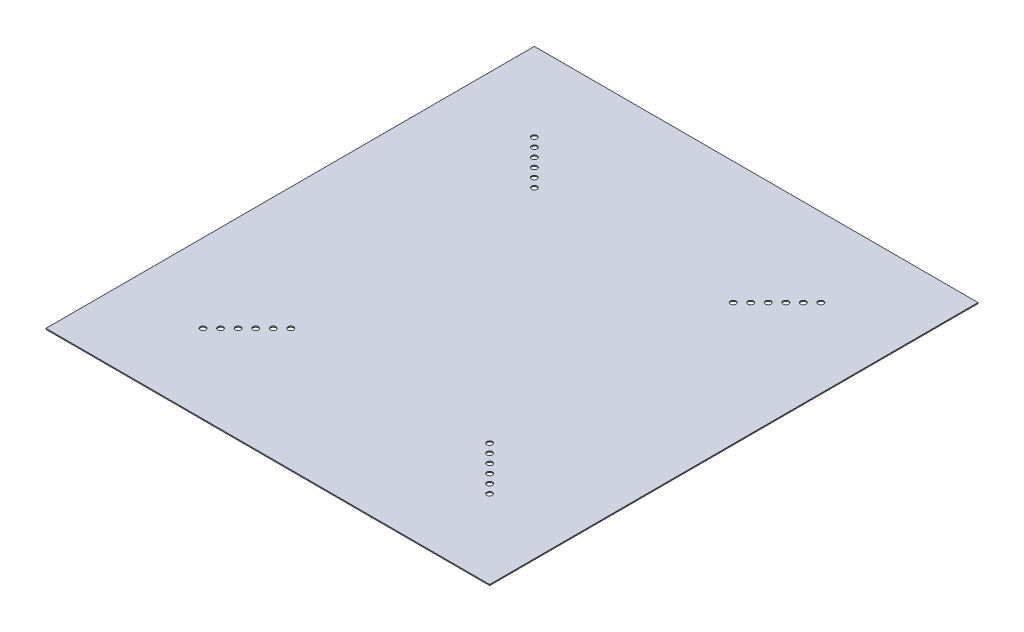
ISO-10303-21;
HEADER;
FILE_DESCRIPTION(('STEP AP214'),'2;1');
FILE_NAME('part.step','',(''),(''),'','','');
FILE_SCHEMA(('AUTOMOTIVE_DESIGN { 1 0 10303 214 1 1 1 1 }'));
ENDSEC;
DATA;
#1=APPLICATION_CONTEXT('core data for automotive mechanical design processes');
#2=APPLICATION_PROTOCOL_DEFINITION('international standard','automotive_design',2000,#1);
#3=PRODUCT_CONTEXT('',#1,'mechanical');
#4=PRODUCT('Part','Part','',(#3));
#5=PRODUCT_RELATED_PRODUCT_CATEGORY('part','',(#4));
#6=PRODUCT_DEFINITION_FORMATION('','',#4);
#7=PRODUCT_DEFINITION_CONTEXT('part definition',#1,'design');
#8=PRODUCT_DEFINITION('design','',#6,#7);
#9=PRODUCT_DEFINITION_SHAPE('','',#8);
#10=(LENGTH_UNIT() NAMED_UNIT(*) SI_UNIT(.MILLI.,.METRE.));
#11=(NAMED_UNIT(*) PLANE_ANGLE_UNIT() SI_UNIT($,.RADIAN.));
#12=(NAMED_UNIT(*) SI_UNIT($,.STERADIAN.) SOLID_ANGLE_UNIT());
#13=UNCERTAINTY_MEASURE_WITH_UNIT(LENGTH_MEASURE(1.E-05),#10,'distance_accuracy_value','');
#14=(GEOMETRIC_REPRESENTATION_CONTEXT(3) GLOBAL_UNCERTAINTY_ASSIGNED_CONTEXT((#13)) GLOBAL_UNIT_ASSIGNED_CONTEXT((#10,
#11,#12)) REPRESENTATION_CONTEXT('',''));
#15=CARTESIAN_POINT('',(0.,0.,0.));
#16=DIRECTION('',(0.,0.,1.));
#17=DIRECTION('',(1.,0.,0.));
#18=AXIS2_PLACEMENT_3D('',#15,#16,#17);
#19=CARTESIAN_POINT('',(0.,0.79375,0.));
#20=DIRECTION('',(0.,-1.,0.));
#21=DIRECTION('',(0.,0.,-1.));
#22=AXIS2_PLACEMENT_3D('',#19,#20,#21);
#23=PLANE('',#22);
#24=CARTESIAN_POINT('',(101.375082938258,0.793750000000001,119.392074349267));
#25=DIRECTION('',(0.,1.,0.));
#26=DIRECTION('',(0.,0.,1.));
#27=AXIS2_PLACEMENT_3D('',#24,#25,#26);
#28=CIRCLE('',#27,2.24999999999999);
#29=CARTESIAN_POINT('',(101.375082938258,0.793750000000001,121.642074349267));
#30=VERTEX_POINT('',#29);
#31=EDGE_CURVE('E235',#30,#30,#28,.T.);
#32=ORIENTED_EDGE('',*,*,#31,.F.);
#33=EDGE_LOOP('',(#32));
#34=FACE_BOUND('',#33,.T.);
#35=CARTESIAN_POINT('',(115.517218561989,0.793750000000001,-133.534209972998));
#36=DIRECTION('',(0.,1.,0.));
#37=DIRECTION('',(0.,0.,1.));
#38=AXIS2_PLACEMENT_3D('',#35,#36,#37);
#39=CIRCLE('',#38,2.24999999999999);
#40=CARTESIAN_POINT('',(115.517218561989,0.793750000000001,-131.284209972998));
#41=VERTEX_POINT('',#40);
#42=EDGE_CURVE('E50',#41,#41,#39,.T.);
#43=ORIENTED_EDGE('',*,*,#42,.F.);
#44=EDGE_LOOP('',(#43));
#45=FACE_BOUND('',#44,.T.);
#46=CARTESIAN_POINT('',(108.446150750124,0.793750000000001,-126.463142161133));
#47=DIRECTION('',(0.,1.,0.));
#48=DIRECTION('',(0.,0.,1.));
#49=AXIS2_PLACEMENT_3D('',#46,#47,#48);
#50=CIRCLE('',#49,2.24999999999999);
#51=CARTESIAN_POINT('',(108.446150750124,0.793750000000001,-124.213142161133));
#52=VERTEX_POINT('',#51);
#53=EDGE_CURVE('E291',#52,#52,#50,.T.);
#54=ORIENTED_EDGE('',*,*,#53,.F.);
#55=EDGE_LOOP('',(#54));
#56=FACE_BOUND('',#55,.T.);
#57=CARTESIAN_POINT('',(101.375082938258,0.793750000000001,-119.392074349267));
#58=DIRECTION('',(0.,1.,0.));
#59=DIRECTION('',(0.,0.,1.));
#60=AXIS2_PLACEMENT_3D('',#57,#58,#59);
#61=CIRCLE('',#60,2.24999999999999);
#62=CARTESIAN_POINT('',(101.375082938258,0.793750000000001,-117.142074349267));
#63=VERTEX_POINT('',#62);
#64=EDGE_CURVE('E283',#63,#63,#61,.T.);
#65=ORIENTED_EDGE('',*,*,#64,.F.);
#66=EDGE_LOOP('',(#65));
#67=FACE_BOUND('',#66,.T.);
#68=CARTESIAN_POINT('',(94.3040151263927,0.793750000000001,-112.321006537402));
#69=DIRECTION('',(0.,1.,0.));
#70=DIRECTION('',(0.,0.,1.));
#71=AXIS2_PLACEMENT_3D('',#68,#69,#70);
#72=CIRCLE('',#71,2.24999999999999);
#73=CARTESIAN_POINT('',(94.3040151263927,0.793750000000001,-110.071006537402));
#74=VERTEX_POINT('',#73);
#75=EDGE_CURVE('E275',#74,#74,#72,.T.);
#76=ORIENTED_EDGE('',*,*,#75,.F.);
#77=EDGE_LOOP('',(#76));
#78=FACE_BOUND('',#77,.T.);
#79=CARTESIAN_POINT('',(87.2329473145272,0.793750000000001,-105.249938725536));
#80=DIRECTION('',(0.,1.,0.));
#81=DIRECTION('',(0.,0.,1.));
#82=AXIS2_PLACEMENT_3D('',#79,#80,#81);
#83=CIRCLE('',#82,2.24999999999999);
#84=CARTESIAN_POINT('',(87.2329473145272,0.793750000000001,-102.999938725536));
#85=VERTEX_POINT('',#84);
#86=EDGE_CURVE('E267',#85,#85,#83,.T.);
#87=ORIENTED_EDGE('',*,*,#86,.F.);
#88=EDGE_LOOP('',(#87));
#89=FACE_BOUND('',#88,.T.);
#90=CARTESIAN_POINT('',(80.1618795026618,0.793750000000001,-98.1788709136707));
#91=DIRECTION('',(0.,1.,0.));
#92=DIRECTION('',(0.,0.,1.));
#93=AXIS2_PLACEMENT_3D('',#90,#91,#92);
#94=CIRCLE('',#93,2.24999999999999);
#95=CARTESIAN_POINT('',(80.1618795026618,0.793750000000001,-95.9288709136707));
#96=VERTEX_POINT('',#95);
#97=EDGE_CURVE('E259',#96,#96,#94,.T.);
#98=ORIENTED_EDGE('',*,*,#97,.F.);
#99=EDGE_LOOP('',(#98));
#100=FACE_BOUND('',#99,.T.);
#101=CARTESIAN_POINT('',(115.517218561989,0.793750000000001,133.534209972998));
#102=DIRECTION('',(0.,1.,0.));
#103=DIRECTION('',(0.,0.,1.));
#104=AXIS2_PLACEMENT_3D('',#101,#102,#103);
#105=CIRCLE('',#104,2.24999999999999);
#106=CARTESIAN_POINT('',(115.517218561989,0.793750000000001,135.784209972998));
#107=VERTEX_POINT('',#106);
#108=EDGE_CURVE('E251',#107,#107,#105,.T.);
#109=ORIENTED_EDGE('',*,*,#108,.F.);
#110=EDGE_LOOP('',(#109));
#111=FACE_BOUND('',#110,.T.);
#112=CARTESIAN_POINT('',(108.446150750124,0.793750000000001,126.463142161133));
#113=DIRECTION('',(0.,1.,0.));
#114=DIRECTION('',(0.,0.,1.));
#115=AXIS2_PLACEMENT_3D('',#112,#113,#114);
#116=CIRCLE('',#115,2.24999999999999);
#117=CARTESIAN_POINT('',(108.446150750124,0.793750000000001,128.713142161133));
#118=VERTEX_POINT('',#117);
#119=EDGE_CURVE('E243',#118,#118,#116,.T.);
#120=ORIENTED_EDGE('',*,*,#119,.F.);
#121=EDGE_LOOP('',(#120));
#122=FACE_BOUND('',#121,.T.);
#123=CARTESIAN_POINT('',(94.3040151263927,0.793750000000001,112.321006537402));
#124=DIRECTION('',(0.,1.,0.));
#125=DIRECTION('',(0.,0.,1.));
#126=AXIS2_PLACEMENT_3D('',#123,#124,#125);
#127=CIRCLE('',#126,2.24999999999999);
#128=CARTESIAN_POINT('',(94.3040151263927,0.793750000000001,114.571006537402));
#129=VERTEX_POINT('',#128);
#130=EDGE_CURVE('E227',#129,#129,#127,.T.);
#131=ORIENTED_EDGE('',*,*,#130,.F.);
#132=EDGE_LOOP('',(#131));
#133=FACE_BOUND('',#132,.T.);
#134=CARTESIAN_POINT('',(87.2329473145272,0.793750000000001,105.249938725536));
#135=DIRECTION('',(0.,1.,0.));
#136=DIRECTION('',(0.,0.,1.));
#137=AXIS2_PLACEMENT_3D('',#134,#135,#136);
#138=CIRCLE('',#137,2.24999999999999);
#139=CARTESIAN_POINT('',(87.2329473145272,0.793750000000001,107.499938725536));
#140=VERTEX_POINT('',#139);
#141=EDGE_CURVE('E219',#140,#140,#138,.T.);
#142=ORIENTED_EDGE('',*,*,#141,.F.);
#143=EDGE_LOOP('',(#142));
#144=FACE_BOUND('',#143,.T.);
#145=CARTESIAN_POINT('',(80.1618795026618,0.793750000000001,98.1788709136707));
#146=DIRECTION('',(0.,1.,0.));
#147=DIRECTION('',(0.,0.,1.));
#148=AXIS2_PLACEMENT_3D('',#145,#146,#147);
#149=CIRCLE('',#148,2.24999999999999);
#150=CARTESIAN_POINT('',(80.1618795026618,0.793750000000001,100.428870913671));
#151=VERTEX_POINT('',#150);
#152=EDGE_CURVE('E211',#151,#151,#149,.T.);
#153=ORIENTED_EDGE('',*,*,#152,.F.);
#154=EDGE_LOOP('',(#153));
#155=FACE_BOUND('',#154,.T.);
#156=CARTESIAN_POINT('',(-115.517218561989,0.793750000000001,133.534209972998));
#157=DIRECTION('',(0.,1.,0.));
#158=DIRECTION('',(0.,0.,1.));
#159=AXIS2_PLACEMENT_3D('',#156,#157,#158);
#160=CIRCLE('',#159,2.24999999999999);
#161=CARTESIAN_POINT('',(-115.517218561989,0.793750000000001,135.784209972998));
#162=VERTEX_POINT('',#161);
#163=EDGE_CURVE('E203',#162,#162,#160,.T.);
#164=ORIENTED_EDGE('',*,*,#163,.F.);
#165=EDGE_LOOP('',(#164));
#166=FACE_BOUND('',#165,.T.);
#167=CARTESIAN_POINT('',(-108.446150750124,0.793750000000001,126.463142161133));
#168=DIRECTION('',(0.,1.,0.));
#169=DIRECTION('',(0.,0.,1.));
#170=AXIS2_PLACEMENT_3D('',#167,#168,#169);
#171=CIRCLE('',#170,2.24999999999999);
#172=CARTESIAN_POINT('',(-108.446150750124,0.793750000000001,128.713142161133));
#173=VERTEX_POINT('',#172);
#174=EDGE_CURVE('E195',#173,#173,#171,.T.);
#175=ORIENTED_EDGE('',*,*,#174,.F.);
#176=EDGE_LOOP('',(#175));
#177=FACE_BOUND('',#176,.T.);
#178=CARTESIAN_POINT('',(-101.375082938258,0.793750000000001,119.392074349267));
#179=DIRECTION('',(0.,1.,0.));
#180=DIRECTION('',(0.,0.,1.));
#181=AXIS2_PLACEMENT_3D('',#178,#179,#180);
#182=CIRCLE('',#181,2.24999999999999);
#183=CARTESIAN_POINT('',(-101.375082938258,0.793750000000001,121.642074349267));
#184=VERTEX_POINT('',#183);
#185=EDGE_CURVE('E187',#184,#184,#182,.T.);
#186=ORIENTED_EDGE('',*,*,#185,.F.);
#187=EDGE_LOOP('',(#186));
#188=FACE_BOUND('',#187,.T.);
#189=CARTESIAN_POINT('',(-94.3040151263927,0.793750000000001,112.321006537402));
#190=DIRECTION('',(0.,1.,0.));
#191=DIRECTION('',(0.,0.,1.));
#192=AXIS2_PLACEMENT_3D('',#189,#190,#191);
#193=CIRCLE('',#192,2.24999999999999);
#194=CARTESIAN_POINT('',(-94.3040151263927,0.793750000000001,114.571006537402));
#195=VERTEX_POINT('',#194);
#196=EDGE_CURVE('E179',#195,#195,#193,.T.);
#197=ORIENTED_EDGE('',*,*,#196,.F.);
#198=EDGE_LOOP('',(#197));
#199=FACE_BOUND('',#198,.T.);
#200=CARTESIAN_POINT('',(-87.2329473145272,0.793750000000001,105.249938725536));
#201=DIRECTION('',(0.,1.,0.));
#202=DIRECTION('',(0.,0.,1.));
#203=AXIS2_PLACEMENT_3D('',#200,#201,#202);
#204=CIRCLE('',#203,2.24999999999999);
#205=CARTESIAN_POINT('',(-87.2329473145272,0.793750000000001,107.499938725536));
#206=VERTEX_POINT('',#205);
#207=EDGE_CURVE('E171',#206,#206,#204,.T.);
#208=ORIENTED_EDGE('',*,*,#207,.F.);
#209=EDGE_LOOP('',(#208));
#210=FACE_BOUND('',#209,.T.);
#211=CARTESIAN_POINT('',(-80.1618795026618,0.793750000000001,98.1788709136707));
#212=DIRECTION('',(0.,1.,0.));
#213=DIRECTION('',(0.,0.,1.));
#214=AXIS2_PLACEMENT_3D('',#211,#212,#213);
#215=CIRCLE('',#214,2.24999999999999);
#216=CARTESIAN_POINT('',(-80.1618795026618,0.793750000000001,100.428870913671));
#217=VERTEX_POINT('',#216);
#218=EDGE_CURVE('E163',#217,#217,#215,.T.);
#219=ORIENTED_EDGE('',*,*,#218,.F.);
#220=EDGE_LOOP('',(#219));
#221=FACE_BOUND('',#220,.T.);
#222=CARTESIAN_POINT('',(-115.517218561989,0.793750000000001,-133.534209972998));
#223=DIRECTION('',(0.,1.,0.));
#224=DIRECTION('',(0.,0.,1.));
#225=AXIS2_PLACEMENT_3D('',#222,#223,#224);
#226=CIRCLE('',#225,2.24999999999999);
#227=CARTESIAN_POINT('',(-115.517218561989,0.793750000000001,-131.284209972998));
#228=VERTEX_POINT('',#227);
#229=EDGE_CURVE('E155',#228,#228,#226,.T.);
#230=ORIENTED_EDGE('',*,*,#229,.F.);
#231=EDGE_LOOP('',(#230));
#232=FACE_BOUND('',#231,.T.);
#233=CARTESIAN_POINT('',(-108.446150750124,0.793750000000001,-126.463142161133));
#234=DIRECTION('',(0.,1.,0.));
#235=DIRECTION('',(0.,0.,1.));
#236=AXIS2_PLACEMENT_3D('',#233,#234,#235);
#237=CIRCLE('',#236,2.24999999999999);
#238=CARTESIAN_POINT('',(-108.446150750124,0.793750000000001,-124.213142161133));
#239=VERTEX_POINT('',#238);
#240=EDGE_CURVE('E147',#239,#239,#237,.T.);
#241=ORIENTED_EDGE('',*,*,#240,.F.);
#242=EDGE_LOOP('',(#241));
#243=FACE_BOUND('',#242,.T.);
#244=CARTESIAN_POINT('',(-101.375082938258,0.793750000000001,-119.392074349267));
#245=DIRECTION('',(0.,1.,0.));
#246=DIRECTION('',(0.,0.,1.));
#247=AXIS2_PLACEMENT_3D('',#244,#245,#246);
#248=CIRCLE('',#247,2.24999999999999);
#249=CARTESIAN_POINT('',(-101.375082938258,0.793750000000001,-117.142074349267));
#250=VERTEX_POINT('',#249);
#251=EDGE_CURVE('E139',#250,#250,#248,.T.);
#252=ORIENTED_EDGE('',*,*,#251,.F.);
#253=EDGE_LOOP('',(#252));
#254=FACE_BOUND('',#253,.T.);
#255=CARTESIAN_POINT('',(-94.3040151263927,0.793750000000001,-112.321006537402));
#256=DIRECTION('',(0.,1.,0.));
#257=DIRECTION('',(0.,0.,1.));
#258=AXIS2_PLACEMENT_3D('',#255,#256,#257);
#259=CIRCLE('',#258,2.24999999999999);
#260=CARTESIAN_POINT('',(-94.3040151263927,0.793750000000001,-110.071006537402));
#261=VERTEX_POINT('',#260);
#262=EDGE_CURVE('E131',#261,#261,#259,.T.);
#263=ORIENTED_EDGE('',*,*,#262,.F.);
#264=EDGE_LOOP('',(#263));
#265=FACE_BOUND('',#264,.T.);
#266=CARTESIAN_POINT('',(-87.2329473145272,0.793750000000001,-105.249938725536));
#267=DIRECTION('',(0.,1.,0.));
#268=DIRECTION('',(0.,0.,1.));
#269=AXIS2_PLACEMENT_3D('',#266,#267,#268);
#270=CIRCLE('',#269,2.24999999999999);
#271=CARTESIAN_POINT('',(-87.2329473145272,0.793750000000001,-102.999938725536));
#272=VERTEX_POINT('',#271);
#273=EDGE_CURVE('E123',#272,#272,#270,.T.);
#274=ORIENTED_EDGE('',*,*,#273,.F.);
#275=EDGE_LOOP('',(#274));
#276=FACE_BOUND('',#275,.T.);
#277=CARTESIAN_POINT('',(-80.1618795026618,0.793750000000001,-98.1788709136707));
#278=DIRECTION('',(0.,1.,0.));
#279=DIRECTION('',(0.,0.,1.));
#280=AXIS2_PLACEMENT_3D('',#277,#278,#279);
#281=CIRCLE('',#280,2.24999999999999);
#282=CARTESIAN_POINT('',(-80.1618795026618,0.793750000000001,-95.9288709136707));
#283=VERTEX_POINT('',#282);
#284=EDGE_CURVE('E114',#283,#283,#281,.T.);
#285=ORIENTED_EDGE('',*,*,#284,.F.);
#286=EDGE_LOOP('',(#285));
#287=FACE_BOUND('',#286,.T.);
#288=DIRECTION('',(0.,0.,-1.));
#289=VECTOR('',#288,1.);
#290=CARTESIAN_POINT('',(178.833008588991,0.79375,196.85));
#291=LINE('',#290,#289);
#292=CARTESIAN_POINT('',(178.833008588991,0.79375,196.85));
#293=VERTEX_POINT('',#292);
#294=CARTESIAN_POINT('',(178.833008588991,0.79375,-196.85));
#295=VERTEX_POINT('',#294);
#296=EDGE_CURVE('E93',#293,#295,#291,.T.);
#297=ORIENTED_EDGE('',*,*,#296,.T.);
#298=DIRECTION('',(-1.,0.,0.));
#299=VECTOR('',#298,1.);
#300=CARTESIAN_POINT('',(-178.833008588991,0.79375,-196.85));
#301=LINE('',#300,#299);
#302=CARTESIAN_POINT('',(-178.833008588991,0.79375,-196.85));
#303=VERTEX_POINT('',#302);
#304=EDGE_CURVE('E354',#295,#303,#301,.T.);
#305=ORIENTED_EDGE('',*,*,#304,.T.);
#306=DIRECTION('',(0.,0.,1.));
#307=VECTOR('',#306,1.);
#308=CARTESIAN_POINT('',(-178.833008588991,0.79375,196.85));
#309=LINE('',#308,#307);
#310=CARTESIAN_POINT('',(-178.833008588991,0.79375,196.85));
#311=VERTEX_POINT('',#310);
#312=EDGE_CURVE('E358',#303,#311,#309,.T.);
#313=ORIENTED_EDGE('',*,*,#312,.T.);
#314=DIRECTION('',(1.,0.,0.));
#315=VECTOR('',#314,1.);
#316=CARTESIAN_POINT('',(-178.833008588991,0.79375,196.85));
#317=LINE('',#316,#315);
#318=EDGE_CURVE('E119',#311,#293,#317,.T.);
#319=ORIENTED_EDGE('',*,*,#318,.T.);
#320=EDGE_LOOP('',(#297,#305,#313,#319));
#321=FACE_BOUND('',#320,.T.);
#322=ADVANCED_FACE('F41',(#34,#45,#56,#67,#78,#89,#100,#111,#122,#133,#144,#155,#166,#177,#188,
#199,#210,#221,#232,#243,#254,#265,#276,#287,#321),#23,.F.);
#323=CARTESIAN_POINT('',(0.,0.,0.));
#324=DIRECTION('',(0.,-1.,0.));
#325=DIRECTION('',(0.,0.,-1.));
#326=AXIS2_PLACEMENT_3D('',#323,#324,#325);
#327=PLANE('',#326);
#328=CARTESIAN_POINT('',(-87.2329473145272,0.,-105.249938725536));
#329=DIRECTION('',(0.,1.,0.));
#330=DIRECTION('',(0.,0.,1.));
#331=AXIS2_PLACEMENT_3D('',#328,#329,#330);
#332=CIRCLE('',#331,2.25);
#333=CARTESIAN_POINT('',(-87.2329473145272,0.,-102.999938725536));
#334=VERTEX_POINT('',#333);
#335=EDGE_CURVE('E127',#334,#334,#332,.T.);
#336=ORIENTED_EDGE('',*,*,#335,.T.);
#337=EDGE_LOOP('',(#336));
#338=FACE_BOUND('',#337,.T.);
#339=CARTESIAN_POINT('',(-101.375082938258,0.,-119.392074349267));
#340=DIRECTION('',(0.,1.,0.));
#341=DIRECTION('',(0.,0.,1.));
#342=AXIS2_PLACEMENT_3D('',#339,#340,#341);
#343=CIRCLE('',#342,2.25);
#344=CARTESIAN_POINT('',(-101.375082938258,0.,-117.142074349267));
#345=VERTEX_POINT('',#344);
#346=EDGE_CURVE('E143',#345,#345,#343,.T.);
#347=ORIENTED_EDGE('',*,*,#346,.T.);
#348=EDGE_LOOP('',(#347));
#349=FACE_BOUND('',#348,.T.);
#350=CARTESIAN_POINT('',(-115.517218561989,0.,-133.534209972998));
#351=DIRECTION('',(0.,1.,0.));
#352=DIRECTION('',(0.,0.,1.));
#353=AXIS2_PLACEMENT_3D('',#350,#351,#352);
#354=CIRCLE('',#353,2.25);
#355=CARTESIAN_POINT('',(-115.517218561989,0.,-131.284209972998));
#356=VERTEX_POINT('',#355);
#357=EDGE_CURVE('E159',#356,#356,#354,.T.);
#358=ORIENTED_EDGE('',*,*,#357,.T.);
#359=EDGE_LOOP('',(#358));
#360=FACE_BOUND('',#359,.T.);
#361=CARTESIAN_POINT('',(-87.2329473145272,0.,105.249938725536));
#362=DIRECTION('',(0.,1.,0.));
#363=DIRECTION('',(0.,0.,1.));
#364=AXIS2_PLACEMENT_3D('',#361,#362,#363);
#365=CIRCLE('',#364,2.25);
#366=CARTESIAN_POINT('',(-87.2329473145272,0.,107.499938725536));
#367=VERTEX_POINT('',#366);
#368=EDGE_CURVE('E175',#367,#367,#365,.T.);
#369=ORIENTED_EDGE('',*,*,#368,.T.);
#370=EDGE_LOOP('',(#369));
#371=FACE_BOUND('',#370,.T.);
#372=CARTESIAN_POINT('',(-101.375082938258,0.,119.392074349267));
#373=DIRECTION('',(0.,1.,0.));
#374=DIRECTION('',(0.,0.,1.));
#375=AXIS2_PLACEMENT_3D('',#372,#373,#374);
#376=CIRCLE('',#375,2.25);
#377=CARTESIAN_POINT('',(-101.375082938258,0.,121.642074349267));
#378=VERTEX_POINT('',#377);
#379=EDGE_CURVE('E191',#378,#378,#376,.T.);
#380=ORIENTED_EDGE('',*,*,#379,.T.);
#381=EDGE_LOOP('',(#380));
#382=FACE_BOUND('',#381,.T.);
#383=CARTESIAN_POINT('',(-115.517218561989,0.,133.534209972998));
#384=DIRECTION('',(0.,1.,0.));
#385=DIRECTION('',(0.,0.,1.));
#386=AXIS2_PLACEMENT_3D('',#383,#384,#385);
#387=CIRCLE('',#386,2.25);
#388=CARTESIAN_POINT('',(-115.517218561989,0.,135.784209972998));
#389=VERTEX_POINT('',#388);
#390=EDGE_CURVE('E207',#389,#389,#387,.T.);
#391=ORIENTED_EDGE('',*,*,#390,.T.);
#392=EDGE_LOOP('',(#391));
#393=FACE_BOUND('',#392,.T.);
#394=CARTESIAN_POINT('',(80.1618795026618,0.,98.1788709136707));
#395=DIRECTION('',(0.,1.,0.));
#396=DIRECTION('',(0.,0.,1.));
#397=AXIS2_PLACEMENT_3D('',#394,#395,#396);
#398=CIRCLE('',#397,2.25);
#399=CARTESIAN_POINT('',(80.1618795026618,0.,100.428870913671));
#400=VERTEX_POINT('',#399);
#401=EDGE_CURVE('E215',#400,#400,#398,.T.);
#402=ORIENTED_EDGE('',*,*,#401,.T.);
#403=EDGE_LOOP('',(#402));
#404=FACE_BOUND('',#403,.T.);
#405=CARTESIAN_POINT('',(94.3040151263927,0.,112.321006537402));
#406=DIRECTION('',(0.,1.,0.));
#407=DIRECTION('',(0.,0.,1.));
#408=AXIS2_PLACEMENT_3D('',#405,#406,#407);
#409=CIRCLE('',#408,2.25);
#410=CARTESIAN_POINT('',(94.3040151263927,0.,114.571006537402));
#411=VERTEX_POINT('',#410);
#412=EDGE_CURVE('E231',#411,#411,#409,.T.);
#413=ORIENTED_EDGE('',*,*,#412,.T.);
#414=EDGE_LOOP('',(#413));
#415=FACE_BOUND('',#414,.T.);
#416=CARTESIAN_POINT('',(108.446150750124,0.,126.463142161133));
#417=DIRECTION('',(0.,1.,0.));
#418=DIRECTION('',(0.,0.,1.));
#419=AXIS2_PLACEMENT_3D('',#416,#417,#418);
#420=CIRCLE('',#419,2.25);
#421=CARTESIAN_POINT('',(108.446150750124,0.,128.713142161133));
#422=VERTEX_POINT('',#421);
#423=EDGE_CURVE('E247',#422,#422,#420,.T.);
#424=ORIENTED_EDGE('',*,*,#423,.T.);
#425=EDGE_LOOP('',(#424));
#426=FACE_BOUND('',#425,.T.);
#427=CARTESIAN_POINT('',(80.1618795026618,0.,-98.1788709136707));
#428=DIRECTION('',(0.,1.,0.));
#429=DIRECTION('',(0.,0.,1.));
#430=AXIS2_PLACEMENT_3D('',#427,#428,#429);
#431=CIRCLE('',#430,2.25);
#432=CARTESIAN_POINT('',(80.1618795026618,0.,-95.9288709136707));
#433=VERTEX_POINT('',#432);
#434=EDGE_CURVE('E263',#433,#433,#431,.T.);
#435=ORIENTED_EDGE('',*,*,#434,.T.);
#436=EDGE_LOOP('',(#435));
#437=FACE_BOUND('',#436,.T.);
#438=CARTESIAN_POINT('',(94.3040151263927,0.,-112.321006537402));
#439=DIRECTION('',(0.,1.,0.));
#440=DIRECTION('',(0.,0.,1.));
#441=AXIS2_PLACEMENT_3D('',#438,#439,#440);
#442=CIRCLE('',#441,2.25);
#443=CARTESIAN_POINT('',(94.3040151263927,0.,-110.071006537402));
#444=VERTEX_POINT('',#443);
#445=EDGE_CURVE('E279',#444,#444,#442,.T.);
#446=ORIENTED_EDGE('',*,*,#445,.T.);
#447=EDGE_LOOP('',(#446));
#448=FACE_BOUND('',#447,.T.);
#449=CARTESIAN_POINT('',(108.446150750124,0.,-126.463142161133));
#450=DIRECTION('',(0.,1.,0.));
#451=DIRECTION('',(0.,0.,1.));
#452=AXIS2_PLACEMENT_3D('',#449,#450,#451);
#453=CIRCLE('',#452,2.25);
#454=CARTESIAN_POINT('',(108.446150750124,0.,-124.213142161133));
#455=VERTEX_POINT('',#454);
#456=EDGE_CURVE('E295',#455,#455,#453,.T.);
#457=ORIENTED_EDGE('',*,*,#456,.T.);
#458=EDGE_LOOP('',(#457));
#459=FACE_BOUND('',#458,.T.);
#460=CARTESIAN_POINT('',(115.517218561989,0.,-133.534209972998));
#461=DIRECTION('',(0.,1.,0.));
#462=DIRECTION('',(0.,0.,1.));
#463=AXIS2_PLACEMENT_3D('',#460,#461,#462);
#464=CIRCLE('',#463,2.25);
#465=CARTESIAN_POINT('',(115.517218561989,0.,-131.284209972998));
#466=VERTEX_POINT('',#465);
#467=EDGE_CURVE('E11',#466,#466,#464,.T.);
#468=ORIENTED_EDGE('',*,*,#467,.T.);
#469=EDGE_LOOP('',(#468));
#470=FACE_BOUND('',#469,.T.);
#471=CARTESIAN_POINT('',(101.375082938258,0.,-119.392074349267));
#472=DIRECTION('',(0.,1.,0.));
#473=DIRECTION('',(0.,0.,1.));
#474=AXIS2_PLACEMENT_3D('',#471,#472,#473);
#475=CIRCLE('',#474,2.25);
#476=CARTESIAN_POINT('',(101.375082938258,0.,-117.142074349267));
#477=VERTEX_POINT('',#476);
#478=EDGE_CURVE('E287',#477,#477,#475,.T.);
#479=ORIENTED_EDGE('',*,*,#478,.T.);
#480=EDGE_LOOP('',(#479));
#481=FACE_BOUND('',#480,.T.);
#482=CARTESIAN_POINT('',(87.2329473145272,0.,-105.249938725536));
#483=DIRECTION('',(0.,1.,0.));
#484=DIRECTION('',(0.,0.,1.));
#485=AXIS2_PLACEMENT_3D('',#482,#483,#484);
#486=CIRCLE('',#485,2.25);
#487=CARTESIAN_POINT('',(87.2329473145272,0.,-102.999938725536));
#488=VERTEX_POINT('',#487);
#489=EDGE_CURVE('E271',#488,#488,#486,.T.);
#490=ORIENTED_EDGE('',*,*,#489,.T.);
#491=EDGE_LOOP('',(#490));
#492=FACE_BOUND('',#491,.T.);
#493=CARTESIAN_POINT('',(115.517218561989,0.,133.534209972998));
#494=DIRECTION('',(0.,1.,0.));
#495=DIRECTION('',(0.,0.,1.));
#496=AXIS2_PLACEMENT_3D('',#493,#494,#495);
#497=CIRCLE('',#496,2.25);
#498=CARTESIAN_POINT('',(115.517218561989,0.,135.784209972998));
#499=VERTEX_POINT('',#498);
#500=EDGE_CURVE('E255',#499,#499,#497,.T.);
#501=ORIENTED_EDGE('',*,*,#500,.T.);
#502=EDGE_LOOP('',(#501));
#503=FACE_BOUND('',#502,.T.);
#504=CARTESIAN_POINT('',(101.375082938258,0.,119.392074349267));
#505=DIRECTION('',(0.,1.,0.));
#506=DIRECTION('',(0.,0.,1.));
#507=AXIS2_PLACEMENT_3D('',#504,#505,#506);
#508=CIRCLE('',#507,2.25);
#509=CARTESIAN_POINT('',(101.375082938258,0.,121.642074349267));
#510=VERTEX_POINT('',#509);
#511=EDGE_CURVE('E239',#510,#510,#508,.T.);
#512=ORIENTED_EDGE('',*,*,#511,.T.);
#513=EDGE_LOOP('',(#512));
#514=FACE_BOUND('',#513,.T.);
#515=CARTESIAN_POINT('',(87.2329473145272,0.,105.249938725536));
#516=DIRECTION('',(0.,1.,0.));
#517=DIRECTION('',(0.,0.,1.));
#518=AXIS2_PLACEMENT_3D('',#515,#516,#517);
#519=CIRCLE('',#518,2.25);
#520=CARTESIAN_POINT('',(87.2329473145272,0.,107.499938725536));
#521=VERTEX_POINT('',#520);
#522=EDGE_CURVE('E223',#521,#521,#519,.T.);
#523=ORIENTED_EDGE('',*,*,#522,.T.);
#524=EDGE_LOOP('',(#523));
#525=FACE_BOUND('',#524,.T.);
#526=CARTESIAN_POINT('',(-108.446150750124,0.,126.463142161133));
#527=DIRECTION('',(0.,1.,0.));
#528=DIRECTION('',(0.,0.,1.));
#529=AXIS2_PLACEMENT_3D('',#526,#527,#528);
#530=CIRCLE('',#529,2.25);
#531=CARTESIAN_POINT('',(-108.446150750124,0.,128.713142161133));
#532=VERTEX_POINT('',#531);
#533=EDGE_CURVE('E199',#532,#532,#530,.T.);
#534=ORIENTED_EDGE('',*,*,#533,.T.);
#535=EDGE_LOOP('',(#534));
#536=FACE_BOUND('',#535,.T.);
#537=CARTESIAN_POINT('',(-94.3040151263927,0.,112.321006537402));
#538=DIRECTION('',(0.,1.,0.));
#539=DIRECTION('',(0.,0.,1.));
#540=AXIS2_PLACEMENT_3D('',#537,#538,#539);
#541=CIRCLE('',#540,2.25);
#542=CARTESIAN_POINT('',(-94.3040151263927,0.,114.571006537402));
#543=VERTEX_POINT('',#542);
#544=EDGE_CURVE('E183',#543,#543,#541,.T.);
#545=ORIENTED_EDGE('',*,*,#544,.T.);
#546=EDGE_LOOP('',(#545));
#547=FACE_BOUND('',#546,.T.);
#548=CARTESIAN_POINT('',(-80.1618795026618,0.,98.1788709136707));
#549=DIRECTION('',(0.,1.,0.));
#550=DIRECTION('',(0.,0.,1.));
#551=AXIS2_PLACEMENT_3D('',#548,#549,#550);
#552=CIRCLE('',#551,2.25);
#553=CARTESIAN_POINT('',(-80.1618795026618,0.,100.428870913671));
#554=VERTEX_POINT('',#553);
#555=EDGE_CURVE('E167',#554,#554,#552,.T.);
#556=ORIENTED_EDGE('',*,*,#555,.T.);
#557=EDGE_LOOP('',(#556));
#558=FACE_BOUND('',#557,.T.);
#559=CARTESIAN_POINT('',(-108.446150750124,0.,-126.463142161133));
#560=DIRECTION('',(0.,1.,0.));
#561=DIRECTION('',(0.,0.,1.));
#562=AXIS2_PLACEMENT_3D('',#559,#560,#561);
#563=CIRCLE('',#562,2.25);
#564=CARTESIAN_POINT('',(-108.446150750124,0.,-124.213142161133));
#565=VERTEX_POINT('',#564);
#566=EDGE_CURVE('E151',#565,#565,#563,.T.);
#567=ORIENTED_EDGE('',*,*,#566,.T.);
#568=EDGE_LOOP('',(#567));
#569=FACE_BOUND('',#568,.T.);
#570=CARTESIAN_POINT('',(-94.3040151263927,0.,-112.321006537402));
#571=DIRECTION('',(0.,1.,0.));
#572=DIRECTION('',(0.,0.,1.));
#573=AXIS2_PLACEMENT_3D('',#570,#571,#572);
#574=CIRCLE('',#573,2.25);
#575=CARTESIAN_POINT('',(-94.3040151263927,0.,-110.071006537402));
#576=VERTEX_POINT('',#575);
#577=EDGE_CURVE('E135',#576,#576,#574,.T.);
#578=ORIENTED_EDGE('',*,*,#577,.T.);
#579=EDGE_LOOP('',(#578));
#580=FACE_BOUND('',#579,.T.);
#581=CARTESIAN_POINT('',(-80.1618795026618,0.,-98.1788709136707));
#582=DIRECTION('',(0.,1.,0.));
#583=DIRECTION('',(0.,0.,1.));
#584=AXIS2_PLACEMENT_3D('',#581,#582,#583);
#585=CIRCLE('',#584,2.25);
#586=CARTESIAN_POINT('',(-80.1618795026618,0.,-95.9288709136707));
#587=VERTEX_POINT('',#586);
#588=EDGE_CURVE('E118',#587,#587,#585,.T.);
#589=ORIENTED_EDGE('',*,*,#588,.T.);
#590=EDGE_LOOP('',(#589));
#591=FACE_BOUND('',#590,.T.);
#592=DIRECTION('',(0.,0.,-1.));
#593=VECTOR('',#592,1.);
#594=CARTESIAN_POINT('',(178.833008588991,0.,196.85));
#595=LINE('',#594,#593);
#596=CARTESIAN_POINT('',(178.833008588991,0.,196.85));
#597=VERTEX_POINT('',#596);
#598=CARTESIAN_POINT('',(178.833008588991,0.,-196.85));
#599=VERTEX_POINT('',#598);
#600=EDGE_CURVE('E79',#597,#599,#595,.T.);
#601=ORIENTED_EDGE('',*,*,#600,.F.);
#602=DIRECTION('',(1.,0.,0.));
#603=VECTOR('',#602,1.);
#604=CARTESIAN_POINT('',(-178.833008588991,0.,196.85));
#605=LINE('',#604,#603);
#606=CARTESIAN_POINT('',(-178.833008588991,0.,196.85));
#607=VERTEX_POINT('',#606);
#608=EDGE_CURVE('E82',#607,#597,#605,.T.);
#609=ORIENTED_EDGE('',*,*,#608,.F.);
#610=DIRECTION('',(0.,0.,1.));
#611=VECTOR('',#610,1.);
#612=CARTESIAN_POINT('',(-178.833008588991,0.,196.85));
#613=LINE('',#612,#611);
#614=CARTESIAN_POINT('',(-178.833008588991,0.,-196.85));
#615=VERTEX_POINT('',#614);
#616=EDGE_CURVE('E63',#615,#607,#613,.T.);
#617=ORIENTED_EDGE('',*,*,#616,.F.);
#618=DIRECTION('',(-1.,0.,0.));
#619=VECTOR('',#618,1.);
#620=CARTESIAN_POINT('',(-178.833008588991,0.,-196.85));
#621=LINE('',#620,#619);
#622=EDGE_CURVE('E57',#599,#615,#621,.T.);
#623=ORIENTED_EDGE('',*,*,#622,.F.);
#624=EDGE_LOOP('',(#601,#609,#617,#623));
#625=FACE_BOUND('',#624,.T.);
#626=ADVANCED_FACE('F43',(#338,#349,#360,#371,#382,#393,#404,#415,#426,#437,#448,#459,#470,#481,
#492,#503,#514,#525,#536,#547,#558,#569,#580,#591,#625),#327,.T.);
#627=CARTESIAN_POINT('',(115.517218561989,0.79375,-133.534209972998));
#628=DIRECTION('',(0.,1.,0.));
#629=DIRECTION('',(0.,0.,1.));
#630=AXIS2_PLACEMENT_3D('',#627,#628,#629);
#631=CYLINDRICAL_SURFACE('',#630,2.25);
#632=ORIENTED_EDGE('',*,*,#467,.F.);
#633=EDGE_LOOP('',(#632));
#634=FACE_BOUND('',#633,.T.);
#635=ORIENTED_EDGE('',*,*,#42,.T.);
#636=EDGE_LOOP('',(#635));
#637=FACE_BOUND('',#636,.T.);
#638=ADVANCED_FACE('F302',(#634,#637),#631,.F.);
#639=CARTESIAN_POINT('',(108.446150750124,0.79375,-126.463142161133));
#640=DIRECTION('',(0.,1.,0.));
#641=DIRECTION('',(0.,0.,1.));
#642=AXIS2_PLACEMENT_3D('',#639,#640,#641);
#643=CYLINDRICAL_SURFACE('',#642,2.25);
#644=ORIENTED_EDGE('',*,*,#456,.F.);
#645=EDGE_LOOP('',(#644));
#646=FACE_BOUND('',#645,.T.);
#647=ORIENTED_EDGE('',*,*,#53,.T.);
#648=EDGE_LOOP('',(#647));
#649=FACE_BOUND('',#648,.T.);
#650=ADVANCED_FACE('F468',(#646,#649),#643,.F.);
#651=CARTESIAN_POINT('',(101.375082938258,0.79375,-119.392074349267));
#652=DIRECTION('',(0.,1.,0.));
#653=DIRECTION('',(0.,0.,1.));
#654=AXIS2_PLACEMENT_3D('',#651,#652,#653);
#655=CYLINDRICAL_SURFACE('',#654,2.25);
#656=ORIENTED_EDGE('',*,*,#478,.F.);
#657=EDGE_LOOP('',(#656));
#658=FACE_BOUND('',#657,.T.);
#659=ORIENTED_EDGE('',*,*,#64,.T.);
#660=EDGE_LOOP('',(#659));
#661=FACE_BOUND('',#660,.T.);
#662=ADVANCED_FACE('F464',(#658,#661),#655,.F.);
#663=CARTESIAN_POINT('',(94.3040151263927,0.79375,-112.321006537402));
#664=DIRECTION('',(0.,1.,0.));
#665=DIRECTION('',(0.,0.,1.));
#666=AXIS2_PLACEMENT_3D('',#663,#664,#665);
#667=CYLINDRICAL_SURFACE('',#666,2.25);
#668=ORIENTED_EDGE('',*,*,#445,.F.);
#669=EDGE_LOOP('',(#668));
#670=FACE_BOUND('',#669,.T.);
#671=ORIENTED_EDGE('',*,*,#75,.T.);
#672=EDGE_LOOP('',(#671));
#673=FACE_BOUND('',#672,.T.);
#674=ADVANCED_FACE('F460',(#670,#673),#667,.F.);
#675=CARTESIAN_POINT('',(87.2329473145272,0.79375,-105.249938725536));
#676=DIRECTION('',(0.,1.,0.));
#677=DIRECTION('',(0.,0.,1.));
#678=AXIS2_PLACEMENT_3D('',#675,#676,#677);
#679=CYLINDRICAL_SURFACE('',#678,2.25);
#680=ORIENTED_EDGE('',*,*,#489,.F.);
#681=EDGE_LOOP('',(#680));
#682=FACE_BOUND('',#681,.T.);
#683=ORIENTED_EDGE('',*,*,#86,.T.);
#684=EDGE_LOOP('',(#683));
#685=FACE_BOUND('',#684,.T.);
#686=ADVANCED_FACE('F456',(#682,#685),#679,.F.);
#687=CARTESIAN_POINT('',(80.1618795026618,0.79375,-98.1788709136707));
#688=DIRECTION('',(0.,1.,0.));
#689=DIRECTION('',(0.,0.,1.));
#690=AXIS2_PLACEMENT_3D('',#687,#688,#689);
#691=CYLINDRICAL_SURFACE('',#690,2.25);
#692=ORIENTED_EDGE('',*,*,#434,.F.);
#693=EDGE_LOOP('',(#692));
#694=FACE_BOUND('',#693,.T.);
#695=ORIENTED_EDGE('',*,*,#97,.T.);
#696=EDGE_LOOP('',(#695));
#697=FACE_BOUND('',#696,.T.);
#698=ADVANCED_FACE('F452',(#694,#697),#691,.F.);
#699=CARTESIAN_POINT('',(115.517218561989,0.79375,133.534209972998));
#700=DIRECTION('',(0.,1.,0.));
#701=DIRECTION('',(0.,0.,1.));
#702=AXIS2_PLACEMENT_3D('',#699,#700,#701);
#703=CYLINDRICAL_SURFACE('',#702,2.25);
#704=ORIENTED_EDGE('',*,*,#500,.F.);
#705=EDGE_LOOP('',(#704));
#706=FACE_BOUND('',#705,.T.);
#707=ORIENTED_EDGE('',*,*,#108,.T.);
#708=EDGE_LOOP('',(#707));
#709=FACE_BOUND('',#708,.T.);
#710=ADVANCED_FACE('F448',(#706,#709),#703,.F.);
#711=CARTESIAN_POINT('',(108.446150750124,0.79375,126.463142161133));
#712=DIRECTION('',(0.,1.,0.));
#713=DIRECTION('',(0.,0.,1.));
#714=AXIS2_PLACEMENT_3D('',#711,#712,#713);
#715=CYLINDRICAL_SURFACE('',#714,2.25);
#716=ORIENTED_EDGE('',*,*,#423,.F.);
#717=EDGE_LOOP('',(#716));
#718=FACE_BOUND('',#717,.T.);
#719=ORIENTED_EDGE('',*,*,#119,.T.);
#720=EDGE_LOOP('',(#719));
#721=FACE_BOUND('',#720,.T.);
#722=ADVANCED_FACE('F444',(#718,#721),#715,.F.);
#723=CARTESIAN_POINT('',(101.375082938258,0.79375,119.392074349267));
#724=DIRECTION('',(0.,1.,0.));
#725=DIRECTION('',(0.,0.,1.));
#726=AXIS2_PLACEMENT_3D('',#723,#724,#725);
#727=CYLINDRICAL_SURFACE('',#726,2.25);
#728=ORIENTED_EDGE('',*,*,#511,.F.);
#729=EDGE_LOOP('',(#728));
#730=FACE_BOUND('',#729,.T.);
#731=ORIENTED_EDGE('',*,*,#31,.T.);
#732=EDGE_LOOP('',(#731));
#733=FACE_BOUND('',#732,.T.);
#734=ADVANCED_FACE('F440',(#730,#733),#727,.F.);
#735=CARTESIAN_POINT('',(94.3040151263927,0.79375,112.321006537402));
#736=DIRECTION('',(0.,1.,0.));
#737=DIRECTION('',(0.,0.,1.));
#738=AXIS2_PLACEMENT_3D('',#735,#736,#737);
#739=CYLINDRICAL_SURFACE('',#738,2.25);
#740=ORIENTED_EDGE('',*,*,#412,.F.);
#741=EDGE_LOOP('',(#740));
#742=FACE_BOUND('',#741,.T.);
#743=ORIENTED_EDGE('',*,*,#130,.T.);
#744=EDGE_LOOP('',(#743));
#745=FACE_BOUND('',#744,.T.);
#746=ADVANCED_FACE('F436',(#742,#745),#739,.F.);
#747=CARTESIAN_POINT('',(87.2329473145272,0.79375,105.249938725536));
#748=DIRECTION('',(0.,1.,0.));
#749=DIRECTION('',(0.,0.,1.));
#750=AXIS2_PLACEMENT_3D('',#747,#748,#749);
#751=CYLINDRICAL_SURFACE('',#750,2.25);
#752=ORIENTED_EDGE('',*,*,#522,.F.);
#753=EDGE_LOOP('',(#752));
#754=FACE_BOUND('',#753,.T.);
#755=ORIENTED_EDGE('',*,*,#141,.T.);
#756=EDGE_LOOP('',(#755));
#757=FACE_BOUND('',#756,.T.);
#758=ADVANCED_FACE('F432',(#754,#757),#751,.F.);
#759=CARTESIAN_POINT('',(80.1618795026618,0.79375,98.1788709136707));
#760=DIRECTION('',(0.,1.,0.));
#761=DIRECTION('',(0.,0.,1.));
#762=AXIS2_PLACEMENT_3D('',#759,#760,#761);
#763=CYLINDRICAL_SURFACE('',#762,2.25);
#764=ORIENTED_EDGE('',*,*,#401,.F.);
#765=EDGE_LOOP('',(#764));
#766=FACE_BOUND('',#765,.T.);
#767=ORIENTED_EDGE('',*,*,#152,.T.);
#768=EDGE_LOOP('',(#767));
#769=FACE_BOUND('',#768,.T.);
#770=ADVANCED_FACE('F428',(#766,#769),#763,.F.);
#771=CARTESIAN_POINT('',(-115.517218561989,0.79375,133.534209972998));
#772=DIRECTION('',(0.,1.,0.));
#773=DIRECTION('',(0.,0.,1.));
#774=AXIS2_PLACEMENT_3D('',#771,#772,#773);
#775=CYLINDRICAL_SURFACE('',#774,2.25);
#776=ORIENTED_EDGE('',*,*,#390,.F.);
#777=EDGE_LOOP('',(#776));
#778=FACE_BOUND('',#777,.T.);
#779=ORIENTED_EDGE('',*,*,#163,.T.);
#780=EDGE_LOOP('',(#779));
#781=FACE_BOUND('',#780,.T.);
#782=ADVANCED_FACE('F424',(#778,#781),#775,.F.);
#783=CARTESIAN_POINT('',(-108.446150750124,0.79375,126.463142161133));
#784=DIRECTION('',(0.,1.,0.));
#785=DIRECTION('',(0.,0.,1.));
#786=AXIS2_PLACEMENT_3D('',#783,#784,#785);
#787=CYLINDRICAL_SURFACE('',#786,2.25);
#788=ORIENTED_EDGE('',*,*,#533,.F.);
#789=EDGE_LOOP('',(#788));
#790=FACE_BOUND('',#789,.T.);
#791=ORIENTED_EDGE('',*,*,#174,.T.);
#792=EDGE_LOOP('',(#791));
#793=FACE_BOUND('',#792,.T.);
#794=ADVANCED_FACE('F420',(#790,#793),#787,.F.);
#795=CARTESIAN_POINT('',(-101.375082938258,0.79375,119.392074349267));
#796=DIRECTION('',(0.,1.,0.));
#797=DIRECTION('',(0.,0.,1.));
#798=AXIS2_PLACEMENT_3D('',#795,#796,#797);
#799=CYLINDRICAL_SURFACE('',#798,2.25);
#800=ORIENTED_EDGE('',*,*,#379,.F.);
#801=EDGE_LOOP('',(#800));
#802=FACE_BOUND('',#801,.T.);
#803=ORIENTED_EDGE('',*,*,#185,.T.);
#804=EDGE_LOOP('',(#803));
#805=FACE_BOUND('',#804,.T.);
#806=ADVANCED_FACE('F416',(#802,#805),#799,.F.);
#807=CARTESIAN_POINT('',(-94.3040151263927,0.79375,112.321006537402));
#808=DIRECTION('',(0.,1.,0.));
#809=DIRECTION('',(0.,0.,1.));
#810=AXIS2_PLACEMENT_3D('',#807,#808,#809);
#811=CYLINDRICAL_SURFACE('',#810,2.25);
#812=ORIENTED_EDGE('',*,*,#544,.F.);
#813=EDGE_LOOP('',(#812));
#814=FACE_BOUND('',#813,.T.);
#815=ORIENTED_EDGE('',*,*,#196,.T.);
#816=EDGE_LOOP('',(#815));
#817=FACE_BOUND('',#816,.T.);
#818=ADVANCED_FACE('F412',(#814,#817),#811,.F.);
#819=CARTESIAN_POINT('',(-87.2329473145272,0.79375,105.249938725536));
#820=DIRECTION('',(0.,1.,0.));
#821=DIRECTION('',(0.,0.,1.));
#822=AXIS2_PLACEMENT_3D('',#819,#820,#821);
#823=CYLINDRICAL_SURFACE('',#822,2.25);
#824=ORIENTED_EDGE('',*,*,#368,.F.);
#825=EDGE_LOOP('',(#824));
#826=FACE_BOUND('',#825,.T.);
#827=ORIENTED_EDGE('',*,*,#207,.T.);
#828=EDGE_LOOP('',(#827));
#829=FACE_BOUND('',#828,.T.);
#830=ADVANCED_FACE('F408',(#826,#829),#823,.F.);
#831=CARTESIAN_POINT('',(-80.1618795026618,0.79375,98.1788709136707));
#832=DIRECTION('',(0.,1.,0.));
#833=DIRECTION('',(0.,0.,1.));
#834=AXIS2_PLACEMENT_3D('',#831,#832,#833);
#835=CYLINDRICAL_SURFACE('',#834,2.25);
#836=ORIENTED_EDGE('',*,*,#555,.F.);
#837=EDGE_LOOP('',(#836));
#838=FACE_BOUND('',#837,.T.);
#839=ORIENTED_EDGE('',*,*,#218,.T.);
#840=EDGE_LOOP('',(#839));
#841=FACE_BOUND('',#840,.T.);
#842=ADVANCED_FACE('F404',(#838,#841),#835,.F.);
#843=CARTESIAN_POINT('',(-115.517218561989,0.79375,-133.534209972998));
#844=DIRECTION('',(0.,1.,0.));
#845=DIRECTION('',(0.,0.,1.));
#846=AXIS2_PLACEMENT_3D('',#843,#844,#845);
#847=CYLINDRICAL_SURFACE('',#846,2.25);
#848=ORIENTED_EDGE('',*,*,#357,.F.);
#849=EDGE_LOOP('',(#848));
#850=FACE_BOUND('',#849,.T.);
#851=ORIENTED_EDGE('',*,*,#229,.T.);
#852=EDGE_LOOP('',(#851));
#853=FACE_BOUND('',#852,.T.);
#854=ADVANCED_FACE('F400',(#850,#853),#847,.F.);
#855=CARTESIAN_POINT('',(-108.446150750124,0.79375,-126.463142161133));
#856=DIRECTION('',(0.,1.,0.));
#857=DIRECTION('',(0.,0.,1.));
#858=AXIS2_PLACEMENT_3D('',#855,#856,#857);
#859=CYLINDRICAL_SURFACE('',#858,2.25);
#860=ORIENTED_EDGE('',*,*,#566,.F.);
#861=EDGE_LOOP('',(#860));
#862=FACE_BOUND('',#861,.T.);
#863=ORIENTED_EDGE('',*,*,#240,.T.);
#864=EDGE_LOOP('',(#863));
#865=FACE_BOUND('',#864,.T.);
#866=ADVANCED_FACE('F396',(#862,#865),#859,.F.);
#867=CARTESIAN_POINT('',(-101.375082938258,0.79375,-119.392074349267));
#868=DIRECTION('',(0.,1.,0.));
#869=DIRECTION('',(0.,0.,1.));
#870=AXIS2_PLACEMENT_3D('',#867,#868,#869);
#871=CYLINDRICAL_SURFACE('',#870,2.25);
#872=ORIENTED_EDGE('',*,*,#346,.F.);
#873=EDGE_LOOP('',(#872));
#874=FACE_BOUND('',#873,.T.);
#875=ORIENTED_EDGE('',*,*,#251,.T.);
#876=EDGE_LOOP('',(#875));
#877=FACE_BOUND('',#876,.T.);
#878=ADVANCED_FACE('F392',(#874,#877),#871,.F.);
#879=CARTESIAN_POINT('',(-94.3040151263927,0.79375,-112.321006537402));
#880=DIRECTION('',(0.,1.,0.));
#881=DIRECTION('',(0.,0.,1.));
#882=AXIS2_PLACEMENT_3D('',#879,#880,#881);
#883=CYLINDRICAL_SURFACE('',#882,2.25);
#884=ORIENTED_EDGE('',*,*,#577,.F.);
#885=EDGE_LOOP('',(#884));
#886=FACE_BOUND('',#885,.T.);
#887=ORIENTED_EDGE('',*,*,#262,.T.);
#888=EDGE_LOOP('',(#887));
#889=FACE_BOUND('',#888,.T.);
#890=ADVANCED_FACE('F388',(#886,#889),#883,.F.);
#891=CARTESIAN_POINT('',(-87.2329473145272,0.79375,-105.249938725536));
#892=DIRECTION('',(0.,1.,0.));
#893=DIRECTION('',(0.,0.,1.));
#894=AXIS2_PLACEMENT_3D('',#891,#892,#893);
#895=CYLINDRICAL_SURFACE('',#894,2.25);
#896=ORIENTED_EDGE('',*,*,#335,.F.);
#897=EDGE_LOOP('',(#896));
#898=FACE_BOUND('',#897,.T.);
#899=ORIENTED_EDGE('',*,*,#273,.T.);
#900=EDGE_LOOP('',(#899));
#901=FACE_BOUND('',#900,.T.);
#902=ADVANCED_FACE('F384',(#898,#901),#895,.F.);
#903=CARTESIAN_POINT('',(-80.1618795026618,0.79375,-98.1788709136707));
#904=DIRECTION('',(0.,1.,0.));
#905=DIRECTION('',(0.,0.,1.));
#906=AXIS2_PLACEMENT_3D('',#903,#904,#905);
#907=CYLINDRICAL_SURFACE('',#906,2.25);
#908=ORIENTED_EDGE('',*,*,#588,.F.);
#909=EDGE_LOOP('',(#908));
#910=FACE_BOUND('',#909,.T.);
#911=ORIENTED_EDGE('',*,*,#284,.T.);
#912=EDGE_LOOP('',(#911));
#913=FACE_BOUND('',#912,.T.);
#914=ADVANCED_FACE('F381',(#910,#913),#907,.F.);
#915=CARTESIAN_POINT('',(178.833008588991,-531.906636397743,196.85));
#916=DIRECTION('',(1.,0.,0.));
#917=DIRECTION('',(0.,0.,-1.));
#918=AXIS2_PLACEMENT_3D('',#915,#916,#917);
#919=PLANE('',#918);
#920=DIRECTION('',(0.,1.,0.));
#921=VECTOR('',#920,1.);
#922=CARTESIAN_POINT('',(178.833008588991,-531.906636397743,196.85));
#923=LINE('',#922,#921);
#924=EDGE_CURVE('E90',#597,#293,#923,.T.);
#925=ORIENTED_EDGE('',*,*,#924,.F.);
#926=ORIENTED_EDGE('',*,*,#600,.T.);
#927=DIRECTION('',(0.,1.,0.));
#928=VECTOR('',#927,1.);
#929=CARTESIAN_POINT('',(178.833008588991,-531.906636397743,-196.85));
#930=LINE('',#929,#928);
#931=EDGE_CURVE('E87',#599,#295,#930,.T.);
#932=ORIENTED_EDGE('',*,*,#931,.T.);
#933=ORIENTED_EDGE('',*,*,#296,.F.);
#934=EDGE_LOOP('',(#925,#926,#932,#933));
#935=FACE_BOUND('',#934,.T.);
#936=ADVANCED_FACE('F91',(#935),#919,.T.);
#937=CARTESIAN_POINT('',(-178.833008588991,-531.906636397743,196.85));
#938=DIRECTION('',(0.,0.,1.));
#939=DIRECTION('',(1.,0.,0.));
#940=AXIS2_PLACEMENT_3D('',#937,#938,#939);
#941=PLANE('',#940);
#942=DIRECTION('',(0.,1.,0.));
#943=VECTOR('',#942,1.);
#944=CARTESIAN_POINT('',(-178.833008588991,-531.906636397743,196.85));
#945=LINE('',#944,#943);
#946=EDGE_CURVE('E100',#607,#311,#945,.T.);
#947=ORIENTED_EDGE('',*,*,#946,.F.);
#948=ORIENTED_EDGE('',*,*,#608,.T.);
#949=ORIENTED_EDGE('',*,*,#924,.T.);
#950=ORIENTED_EDGE('',*,*,#318,.F.);
#951=EDGE_LOOP('',(#947,#948,#949,#950));
#952=FACE_BOUND('',#951,.T.);
#953=ADVANCED_FACE('F99',(#952),#941,.T.);
#954=CARTESIAN_POINT('',(-178.833008588991,-531.906636397743,196.85));
#955=DIRECTION('',(-1.,0.,0.));
#956=DIRECTION('',(0.,0.,1.));
#957=AXIS2_PLACEMENT_3D('',#954,#955,#956);
#958=PLANE('',#957);
#959=DIRECTION('',(0.,1.,0.));
#960=VECTOR('',#959,1.);
#961=CARTESIAN_POINT('',(-178.833008588991,-531.906636397743,-196.85));
#962=LINE('',#961,#960);
#963=EDGE_CURVE('E111',#615,#303,#962,.T.);
#964=ORIENTED_EDGE('',*,*,#963,.F.);
#965=ORIENTED_EDGE('',*,*,#616,.T.);
#966=ORIENTED_EDGE('',*,*,#946,.T.);
#967=ORIENTED_EDGE('',*,*,#312,.F.);
#968=EDGE_LOOP('',(#964,#965,#966,#967));
#969=FACE_BOUND('',#968,.T.);
#970=ADVANCED_FACE('F366',(#969),#958,.T.);
#971=CARTESIAN_POINT('',(-178.833008588991,-531.906636397743,-196.85));
#972=DIRECTION('',(0.,0.,-1.));
#973=DIRECTION('',(-1.,0.,0.));
#974=AXIS2_PLACEMENT_3D('',#971,#972,#973);
#975=PLANE('',#974);
#976=ORIENTED_EDGE('',*,*,#931,.F.);
#977=ORIENTED_EDGE('',*,*,#622,.T.);
#978=ORIENTED_EDGE('',*,*,#963,.T.);
#979=ORIENTED_EDGE('',*,*,#304,.F.);
#980=EDGE_LOOP('',(#976,#977,#978,#979));
#981=FACE_BOUND('',#980,.T.);
#982=ADVANCED_FACE('F363',(#981),#975,.T.);
#983=CLOSED_SHELL('',(#322,#626,#638,#650,#662,#674,#686,#698,#710,#722,#734,#746,#758,#770,
#782,#794,#806,#818,#830,#842,#854,#866,#878,#890,#902,#914,#936,#953,#970,#982));
#984=MANIFOLD_SOLID_BREP('B2',#983);
#985=ADVANCED_BREP_SHAPE_REPRESENTATION('',(#18,#984),#14);
#986=SHAPE_DEFINITION_REPRESENTATION(#9,#985);
ENDSEC;
END-ISO-10303-21;
